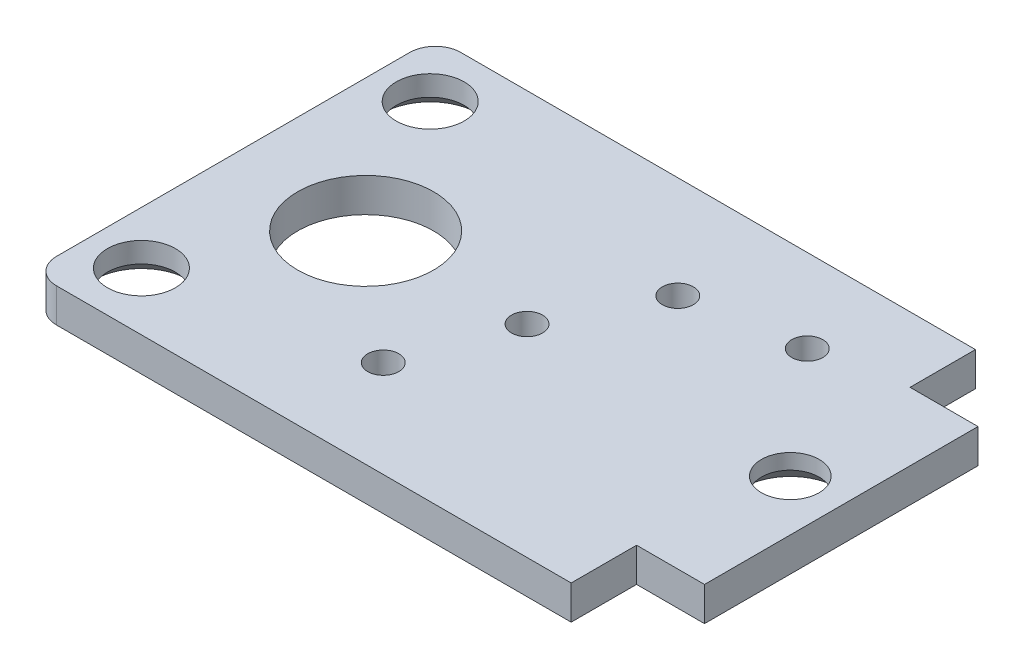
ISO-10303-21;
HEADER;
FILE_DESCRIPTION(('STEP AP214'),'2;1');
FILE_NAME('part.step','',(''),(''),'','','');
FILE_SCHEMA(('AUTOMOTIVE_DESIGN { 1 0 10303 214 1 1 1 1 }'));
ENDSEC;
DATA;
#1=APPLICATION_CONTEXT('core data for automotive mechanical design processes');
#2=APPLICATION_PROTOCOL_DEFINITION('international standard','automotive_design',2000,#1);
#3=PRODUCT_CONTEXT('',#1,'mechanical');
#4=PRODUCT('Part','Part','',(#3));
#5=PRODUCT_RELATED_PRODUCT_CATEGORY('part','',(#4));
#6=PRODUCT_DEFINITION_FORMATION('','',#4);
#7=PRODUCT_DEFINITION_CONTEXT('part definition',#1,'design');
#8=PRODUCT_DEFINITION('design','',#6,#7);
#9=PRODUCT_DEFINITION_SHAPE('','',#8);
#10=(LENGTH_UNIT() NAMED_UNIT(*) SI_UNIT(.MILLI.,.METRE.));
#11=(NAMED_UNIT(*) PLANE_ANGLE_UNIT() SI_UNIT($,.RADIAN.));
#12=(NAMED_UNIT(*) SI_UNIT($,.STERADIAN.) SOLID_ANGLE_UNIT());
#13=UNCERTAINTY_MEASURE_WITH_UNIT(LENGTH_MEASURE(1.E-05),#10,'distance_accuracy_value','');
#14=(GEOMETRIC_REPRESENTATION_CONTEXT(3) GLOBAL_UNCERTAINTY_ASSIGNED_CONTEXT((#13)) GLOBAL_UNIT_ASSIGNED_CONTEXT((#10,
#11,#12)) REPRESENTATION_CONTEXT('',''));
#15=CARTESIAN_POINT('',(0.,0.,0.));
#16=DIRECTION('',(0.,0.,1.));
#17=DIRECTION('',(1.,0.,0.));
#18=AXIS2_PLACEMENT_3D('',#15,#16,#17);
#19=CARTESIAN_POINT('',(0.,1.,0.));
#20=DIRECTION('',(0.,-1.,0.));
#21=DIRECTION('',(0.,0.,-1.));
#22=AXIS2_PLACEMENT_3D('',#19,#20,#21);
#23=PLANE('',#22);
#24=CARTESIAN_POINT('',(12.5,1.,0.));
#25=DIRECTION('',(0.,-1.,0.));
#26=DIRECTION('',(0.,0.,-1.));
#27=AXIS2_PLACEMENT_3D('',#24,#25,#26);
#28=CIRCLE('',#27,0.849999999999998);
#29=CARTESIAN_POINT('',(12.5,1.,-0.849999999999998));
#30=VERTEX_POINT('',#29);
#31=EDGE_CURVE('E515',#30,#30,#28,.T.);
#32=ORIENTED_EDGE('',*,*,#31,.T.);
#33=EDGE_LOOP('',(#32));
#34=FACE_BOUND('',#33,.T.);
#35=CARTESIAN_POINT('',(3.61862915010152,1.,3.1));
#36=DIRECTION('',(0.,1.,0.));
#37=DIRECTION('',(0.,0.,1.));
#38=AXIS2_PLACEMENT_3D('',#35,#36,#37);
#39=CIRCLE('',#38,0.457200000000001);
#40=CARTESIAN_POINT('',(3.61862915010152,1.,3.5572));
#41=VERTEX_POINT('',#40);
#42=EDGE_CURVE('E525',#41,#41,#39,.T.);
#43=ORIENTED_EDGE('',*,*,#42,.F.);
#44=EDGE_LOOP('',(#43));
#45=FACE_BOUND('',#44,.T.);
#46=CARTESIAN_POINT('',(4.75,1.,0.));
#47=DIRECTION('',(0.,1.,0.));
#48=DIRECTION('',(0.,0.,1.));
#49=AXIS2_PLACEMENT_3D('',#46,#47,#48);
#50=CIRCLE('',#49,0.4572);
#51=CARTESIAN_POINT('',(4.75,1.,0.4572));
#52=VERTEX_POINT('',#51);
#53=EDGE_CURVE('E533',#52,#52,#50,.T.);
#54=ORIENTED_EDGE('',*,*,#53,.F.);
#55=EDGE_LOOP('',(#54));
#56=FACE_BOUND('',#55,.T.);
#57=CARTESIAN_POINT('',(6.24777213603638,1.,-2.94052352966492));
#58=DIRECTION('',(0.,1.,0.));
#59=DIRECTION('',(0.,0.,1.));
#60=AXIS2_PLACEMENT_3D('',#57,#58,#59);
#61=CIRCLE('',#60,0.4572);
#62=CARTESIAN_POINT('',(6.24777213603638,1.,-2.48332352966492));
#63=VERTEX_POINT('',#62);
#64=EDGE_CURVE('E541',#63,#63,#61,.T.);
#65=ORIENTED_EDGE('',*,*,#64,.F.);
#66=EDGE_LOOP('',(#65));
#67=FACE_BOUND('',#66,.T.);
#68=CARTESIAN_POINT('',(9.5,1.,-3.5));
#69=DIRECTION('',(0.,1.,0.));
#70=DIRECTION('',(0.,0.,1.));
#71=AXIS2_PLACEMENT_3D('',#68,#69,#70);
#72=CIRCLE('',#71,0.4572);
#73=CARTESIAN_POINT('',(9.5,1.,-3.0428));
#74=VERTEX_POINT('',#73);
#75=EDGE_CURVE('E520',#74,#74,#72,.T.);
#76=ORIENTED_EDGE('',*,*,#75,.F.);
#77=EDGE_LOOP('',(#76));
#78=FACE_BOUND('',#77,.T.);
#79=CARTESIAN_POINT('',(-2.34999999999999,1.,-4.25));
#80=DIRECTION('',(0.,1.,0.));
#81=DIRECTION('',(0.,0.,1.));
#82=AXIS2_PLACEMENT_3D('',#79,#80,#81);
#83=CIRCLE('',#82,1.);
#84=CARTESIAN_POINT('',(-2.34999999999999,1.,-3.25));
#85=VERTEX_POINT('',#84);
#86=EDGE_CURVE('E267',#85,#85,#83,.T.);
#87=ORIENTED_EDGE('',*,*,#86,.F.);
#88=EDGE_LOOP('',(#87));
#89=FACE_BOUND('',#88,.T.);
#90=CARTESIAN_POINT('',(-2.34999999999999,1.,4.25));
#91=DIRECTION('',(0.,1.,0.));
#92=DIRECTION('',(0.,0.,1.));
#93=AXIS2_PLACEMENT_3D('',#90,#91,#92);
#94=CIRCLE('',#93,1.);
#95=CARTESIAN_POINT('',(-2.34999999999999,1.,5.25));
#96=VERTEX_POINT('',#95);
#97=EDGE_CURVE('E274',#96,#96,#94,.T.);
#98=ORIENTED_EDGE('',*,*,#97,.F.);
#99=EDGE_LOOP('',(#98));
#100=FACE_BOUND('',#99,.T.);
#101=DIRECTION('',(-1.,0.,0.));
#102=VECTOR('',#101,1.);
#103=CARTESIAN_POINT('',(12.,1.,-5.95));
#104=LINE('',#103,#102);
#105=CARTESIAN_POINT('',(12.,1.,-5.95));
#106=VERTEX_POINT('',#105);
#107=CARTESIAN_POINT('',(-3.15,1.,-5.95));
#108=VERTEX_POINT('',#107);
#109=EDGE_CURVE('E164',#106,#108,#104,.T.);
#110=ORIENTED_EDGE('',*,*,#109,.T.);
#111=CARTESIAN_POINT('',(-3.14999999999999,1.,-5.2));
#112=DIRECTION('',(0.,-1.,0.));
#113=DIRECTION('',(0.,0.,-1.));
#114=AXIS2_PLACEMENT_3D('',#111,#112,#113);
#115=CIRCLE('',#114,0.75);
#116=CARTESIAN_POINT('',(-3.89999999999999,1.,-5.2));
#117=VERTEX_POINT('',#116);
#118=EDGE_CURVE('E226',#108,#117,#115,.F.);
#119=ORIENTED_EDGE('',*,*,#118,.T.);
#120=DIRECTION('',(0.,0.,1.));
#121=VECTOR('',#120,1.);
#122=CARTESIAN_POINT('',(-3.89999999999999,1.,-5.95));
#123=LINE('',#122,#121);
#124=CARTESIAN_POINT('',(-3.89999999999999,1.,5.2));
#125=VERTEX_POINT('',#124);
#126=EDGE_CURVE('E132',#117,#125,#123,.T.);
#127=ORIENTED_EDGE('',*,*,#126,.T.);
#128=CARTESIAN_POINT('',(-3.15,1.,5.2));
#129=DIRECTION('',(0.,-1.,0.));
#130=DIRECTION('',(0.,0.,-1.));
#131=AXIS2_PLACEMENT_3D('',#128,#129,#130);
#132=CIRCLE('',#131,0.75);
#133=CARTESIAN_POINT('',(-3.15,1.,5.95));
#134=VERTEX_POINT('',#133);
#135=EDGE_CURVE('E60',#125,#134,#132,.F.);
#136=ORIENTED_EDGE('',*,*,#135,.T.);
#137=DIRECTION('',(1.,0.,0.));
#138=VECTOR('',#137,1.);
#139=CARTESIAN_POINT('',(12.,1.,5.95));
#140=LINE('',#139,#138);
#141=CARTESIAN_POINT('',(12.,1.,5.95));
#142=VERTEX_POINT('',#141);
#143=EDGE_CURVE('E122',#134,#142,#140,.T.);
#144=ORIENTED_EDGE('',*,*,#143,.T.);
#145=DIRECTION('',(0.,0.,-1.));
#146=VECTOR('',#145,1.);
#147=CARTESIAN_POINT('',(12.,1.,5.95));
#148=LINE('',#147,#146);
#149=CARTESIAN_POINT('',(12.,1.,4.025));
#150=VERTEX_POINT('',#149);
#151=EDGE_CURVE('E126',#142,#150,#148,.T.);
#152=ORIENTED_EDGE('',*,*,#151,.T.);
#153=DIRECTION('',(1.,0.,0.));
#154=VECTOR('',#153,1.);
#155=CARTESIAN_POINT('',(12.,1.,4.025));
#156=LINE('',#155,#154);
#157=CARTESIAN_POINT('',(14.,1.,4.025));
#158=VERTEX_POINT('',#157);
#159=EDGE_CURVE('E149',#150,#158,#156,.T.);
#160=ORIENTED_EDGE('',*,*,#159,.T.);
#161=DIRECTION('',(0.,0.,-1.));
#162=VECTOR('',#161,1.);
#163=CARTESIAN_POINT('',(14.,1.,-4.025));
#164=LINE('',#163,#162);
#165=CARTESIAN_POINT('',(14.,1.,-4.025));
#166=VERTEX_POINT('',#165);
#167=EDGE_CURVE('E152',#158,#166,#164,.T.);
#168=ORIENTED_EDGE('',*,*,#167,.T.);
#169=DIRECTION('',(-1.,0.,0.));
#170=VECTOR('',#169,1.);
#171=CARTESIAN_POINT('',(12.,1.,-4.025));
#172=LINE('',#171,#170);
#173=CARTESIAN_POINT('',(12.,1.,-4.025));
#174=VERTEX_POINT('',#173);
#175=EDGE_CURVE('E158',#166,#174,#172,.T.);
#176=ORIENTED_EDGE('',*,*,#175,.T.);
#177=DIRECTION('',(0.,0.,-1.));
#178=VECTOR('',#177,1.);
#179=CARTESIAN_POINT('',(12.,1.,-5.95));
#180=LINE('',#179,#178);
#181=EDGE_CURVE('E161',#174,#106,#180,.T.);
#182=ORIENTED_EDGE('',*,*,#181,.T.);
#183=EDGE_LOOP('',(#110,#119,#127,#136,#144,#152,#160,#168,#176,#182));
#184=FACE_BOUND('',#183,.T.);
#185=CARTESIAN_POINT('',(0.,1.,0.));
#186=DIRECTION('',(0.,1.,0.));
#187=DIRECTION('',(0.,0.,1.));
#188=AXIS2_PLACEMENT_3D('',#185,#186,#187);
#189=CIRCLE('',#188,2.);
#190=CARTESIAN_POINT('',(0.,1.,2.));
#191=VERTEX_POINT('',#190);
#192=EDGE_CURVE('E172',#191,#191,#189,.T.);
#193=ORIENTED_EDGE('',*,*,#192,.F.);
#194=EDGE_LOOP('',(#193));
#195=FACE_BOUND('',#194,.T.);
#196=ADVANCED_FACE('F43',(#34,#45,#56,#67,#78,#89,#100,#184,#195),#23,.F.);
#197=CARTESIAN_POINT('',(0.,0.,0.));
#198=DIRECTION('',(0.,-1.,0.));
#199=DIRECTION('',(0.,0.,-1.));
#200=AXIS2_PLACEMENT_3D('',#197,#198,#199);
#201=PLANE('',#200);
#202=CARTESIAN_POINT('',(12.5,0.,0.));
#203=DIRECTION('',(0.,-1.,0.));
#204=DIRECTION('',(0.,0.,-1.));
#205=AXIS2_PLACEMENT_3D('',#202,#203,#204);
#206=CIRCLE('',#205,1.4);
#207=CARTESIAN_POINT('',(12.5,0.,-1.4));
#208=VERTEX_POINT('',#207);
#209=EDGE_CURVE('E511',#208,#208,#206,.T.);
#210=ORIENTED_EDGE('',*,*,#209,.F.);
#211=EDGE_LOOP('',(#210));
#212=FACE_BOUND('',#211,.T.);
#213=CARTESIAN_POINT('',(3.61862915010152,0.,3.1));
#214=DIRECTION('',(0.,1.,0.));
#215=DIRECTION('',(0.,0.,1.));
#216=AXIS2_PLACEMENT_3D('',#213,#214,#215);
#217=CIRCLE('',#216,0.457200000000001);
#218=CARTESIAN_POINT('',(3.61862915010152,0.,3.5572));
#219=VERTEX_POINT('',#218);
#220=EDGE_CURVE('E521',#219,#219,#217,.T.);
#221=ORIENTED_EDGE('',*,*,#220,.T.);
#222=EDGE_LOOP('',(#221));
#223=FACE_BOUND('',#222,.T.);
#224=CARTESIAN_POINT('',(4.75,0.,0.));
#225=DIRECTION('',(0.,1.,0.));
#226=DIRECTION('',(0.,0.,1.));
#227=AXIS2_PLACEMENT_3D('',#224,#225,#226);
#228=CIRCLE('',#227,0.4572);
#229=CARTESIAN_POINT('',(4.75,0.,0.4572));
#230=VERTEX_POINT('',#229);
#231=EDGE_CURVE('E529',#230,#230,#228,.T.);
#232=ORIENTED_EDGE('',*,*,#231,.T.);
#233=EDGE_LOOP('',(#232));
#234=FACE_BOUND('',#233,.T.);
#235=CARTESIAN_POINT('',(6.24777213603638,0.,-2.94052352966492));
#236=DIRECTION('',(0.,1.,0.));
#237=DIRECTION('',(0.,0.,1.));
#238=AXIS2_PLACEMENT_3D('',#235,#236,#237);
#239=CIRCLE('',#238,0.4572);
#240=CARTESIAN_POINT('',(6.24777213603638,0.,-2.48332352966492));
#241=VERTEX_POINT('',#240);
#242=EDGE_CURVE('E537',#241,#241,#239,.T.);
#243=ORIENTED_EDGE('',*,*,#242,.T.);
#244=EDGE_LOOP('',(#243));
#245=FACE_BOUND('',#244,.T.);
#246=CARTESIAN_POINT('',(9.5,0.,-3.5));
#247=DIRECTION('',(0.,1.,0.));
#248=DIRECTION('',(0.,0.,1.));
#249=AXIS2_PLACEMENT_3D('',#246,#247,#248);
#250=CIRCLE('',#249,0.4572);
#251=CARTESIAN_POINT('',(9.5,0.,-3.0428));
#252=VERTEX_POINT('',#251);
#253=EDGE_CURVE('E545',#252,#252,#250,.T.);
#254=ORIENTED_EDGE('',*,*,#253,.T.);
#255=EDGE_LOOP('',(#254));
#256=FACE_BOUND('',#255,.T.);
#257=CARTESIAN_POINT('',(-2.34999999999999,0.,4.25));
#258=DIRECTION('',(0.,-1.,0.));
#259=DIRECTION('',(0.,0.,-1.));
#260=AXIS2_PLACEMENT_3D('',#257,#258,#259);
#261=CIRCLE('',#260,1.4);
#262=CARTESIAN_POINT('',(-2.34999999999999,0.,2.85));
#263=VERTEX_POINT('',#262);
#264=EDGE_CURVE('E236',#263,#263,#261,.F.);
#265=ORIENTED_EDGE('',*,*,#264,.T.);
#266=EDGE_LOOP('',(#265));
#267=FACE_BOUND('',#266,.T.);
#268=CARTESIAN_POINT('',(-2.34999999999999,0.,-4.25));
#269=DIRECTION('',(0.,-1.,0.));
#270=DIRECTION('',(0.,0.,-1.));
#271=AXIS2_PLACEMENT_3D('',#268,#269,#270);
#272=CIRCLE('',#271,1.4);
#273=CARTESIAN_POINT('',(-2.34999999999999,0.,-5.65));
#274=VERTEX_POINT('',#273);
#275=EDGE_CURVE('E232',#274,#274,#272,.F.);
#276=ORIENTED_EDGE('',*,*,#275,.T.);
#277=EDGE_LOOP('',(#276));
#278=FACE_BOUND('',#277,.T.);
#279=DIRECTION('',(0.,0.,1.));
#280=VECTOR('',#279,1.);
#281=CARTESIAN_POINT('',(-3.89999999999999,0.,-5.95));
#282=LINE('',#281,#280);
#283=CARTESIAN_POINT('',(-3.89999999999999,0.,-5.2));
#284=VERTEX_POINT('',#283);
#285=CARTESIAN_POINT('',(-3.89999999999999,0.,5.2));
#286=VERTEX_POINT('',#285);
#287=EDGE_CURVE('E168',#284,#286,#282,.T.);
#288=ORIENTED_EDGE('',*,*,#287,.F.);
#289=CARTESIAN_POINT('',(-3.14999999999999,0.,-5.2));
#290=DIRECTION('',(0.,-1.,0.));
#291=DIRECTION('',(0.,0.,-1.));
#292=AXIS2_PLACEMENT_3D('',#289,#290,#291);
#293=CIRCLE('',#292,0.75);
#294=CARTESIAN_POINT('',(-3.15,0.,-5.95));
#295=VERTEX_POINT('',#294);
#296=EDGE_CURVE('E219',#284,#295,#293,.T.);
#297=ORIENTED_EDGE('',*,*,#296,.T.);
#298=DIRECTION('',(-1.,0.,0.));
#299=VECTOR('',#298,1.);
#300=CARTESIAN_POINT('',(12.,0.,-5.95));
#301=LINE('',#300,#299);
#302=CARTESIAN_POINT('',(12.,0.,-5.95));
#303=VERTEX_POINT('',#302);
#304=EDGE_CURVE('E190',#303,#295,#301,.T.);
#305=ORIENTED_EDGE('',*,*,#304,.F.);
#306=DIRECTION('',(0.,0.,-1.));
#307=VECTOR('',#306,1.);
#308=CARTESIAN_POINT('',(12.,0.,-5.95));
#309=LINE('',#308,#307);
#310=CARTESIAN_POINT('',(12.,0.,-4.025));
#311=VERTEX_POINT('',#310);
#312=EDGE_CURVE('E187',#311,#303,#309,.T.);
#313=ORIENTED_EDGE('',*,*,#312,.F.);
#314=DIRECTION('',(-1.,0.,0.));
#315=VECTOR('',#314,1.);
#316=CARTESIAN_POINT('',(12.,0.,-4.025));
#317=LINE('',#316,#315);
#318=CARTESIAN_POINT('',(14.,0.,-4.025));
#319=VERTEX_POINT('',#318);
#320=EDGE_CURVE('E184',#319,#311,#317,.T.);
#321=ORIENTED_EDGE('',*,*,#320,.F.);
#322=DIRECTION('',(0.,0.,-1.));
#323=VECTOR('',#322,1.);
#324=CARTESIAN_POINT('',(14.,0.,-4.025));
#325=LINE('',#324,#323);
#326=CARTESIAN_POINT('',(14.,0.,4.025));
#327=VERTEX_POINT('',#326);
#328=EDGE_CURVE('E181',#327,#319,#325,.T.);
#329=ORIENTED_EDGE('',*,*,#328,.F.);
#330=DIRECTION('',(1.,0.,0.));
#331=VECTOR('',#330,1.);
#332=CARTESIAN_POINT('',(12.,0.,4.025));
#333=LINE('',#332,#331);
#334=CARTESIAN_POINT('',(12.,0.,4.025));
#335=VERTEX_POINT('',#334);
#336=EDGE_CURVE('E178',#335,#327,#333,.T.);
#337=ORIENTED_EDGE('',*,*,#336,.F.);
#338=DIRECTION('',(0.,0.,-1.));
#339=VECTOR('',#338,1.);
#340=CARTESIAN_POINT('',(12.,0.,5.95));
#341=LINE('',#340,#339);
#342=CARTESIAN_POINT('',(12.,0.,5.95));
#343=VERTEX_POINT('',#342);
#344=EDGE_CURVE('E175',#343,#335,#341,.T.);
#345=ORIENTED_EDGE('',*,*,#344,.F.);
#346=DIRECTION('',(1.,0.,0.));
#347=VECTOR('',#346,1.);
#348=CARTESIAN_POINT('',(12.,0.,5.95));
#349=LINE('',#348,#347);
#350=CARTESIAN_POINT('',(-3.15,0.,5.95));
#351=VERTEX_POINT('',#350);
#352=EDGE_CURVE('E138',#351,#343,#349,.T.);
#353=ORIENTED_EDGE('',*,*,#352,.F.);
#354=CARTESIAN_POINT('',(-3.15,0.,5.2));
#355=DIRECTION('',(0.,-1.,0.));
#356=DIRECTION('',(0.,0.,-1.));
#357=AXIS2_PLACEMENT_3D('',#354,#355,#356);
#358=CIRCLE('',#357,0.75);
#359=EDGE_CURVE('E216',#351,#286,#358,.T.);
#360=ORIENTED_EDGE('',*,*,#359,.T.);
#361=EDGE_LOOP('',(#288,#297,#305,#313,#321,#329,#337,#345,#353,#360));
#362=FACE_BOUND('',#361,.T.);
#363=CARTESIAN_POINT('',(0.,0.,0.));
#364=DIRECTION('',(0.,1.,0.));
#365=DIRECTION('',(0.,0.,1.));
#366=AXIS2_PLACEMENT_3D('',#363,#364,#365);
#367=CIRCLE('',#366,2.);
#368=CARTESIAN_POINT('',(0.,0.,2.));
#369=VERTEX_POINT('',#368);
#370=EDGE_CURVE('E264',#369,#369,#367,.T.);
#371=ORIENTED_EDGE('',*,*,#370,.T.);
#372=EDGE_LOOP('',(#371));
#373=FACE_BOUND('',#372,.T.);
#374=ADVANCED_FACE('F252',(#212,#223,#234,#245,#256,#267,#278,#362,#373),#201,.T.);
#375=CARTESIAN_POINT('',(-3.89999999999999,1.,-5.95));
#376=DIRECTION('',(1.,0.,0.));
#377=DIRECTION('',(0.,0.,-1.));
#378=AXIS2_PLACEMENT_3D('',#375,#376,#377);
#379=PLANE('',#378);
#380=ORIENTED_EDGE('',*,*,#126,.F.);
#381=DIRECTION('',(0.,-1.,0.));
#382=VECTOR('',#381,1.);
#383=CARTESIAN_POINT('',(-3.89999999999999,1.,-5.2));
#384=LINE('',#383,#382);
#385=EDGE_CURVE('E212',#117,#284,#384,.T.);
#386=ORIENTED_EDGE('',*,*,#385,.T.);
#387=ORIENTED_EDGE('',*,*,#287,.T.);
#388=DIRECTION('',(0.,-1.,0.));
#389=VECTOR('',#388,1.);
#390=CARTESIAN_POINT('',(-3.89999999999999,1.,5.2));
#391=LINE('',#390,#389);
#392=EDGE_CURVE('E142',#286,#125,#391,.F.);
#393=ORIENTED_EDGE('',*,*,#392,.T.);
#394=EDGE_LOOP('',(#380,#386,#387,#393));
#395=FACE_BOUND('',#394,.T.);
#396=ADVANCED_FACE('F255',(#395),#379,.F.);
#397=CARTESIAN_POINT('',(12.,1.,5.95));
#398=DIRECTION('',(0.,0.,-1.));
#399=DIRECTION('',(-1.,0.,0.));
#400=AXIS2_PLACEMENT_3D('',#397,#398,#399);
#401=PLANE('',#400);
#402=ORIENTED_EDGE('',*,*,#143,.F.);
#403=DIRECTION('',(0.,-1.,0.));
#404=VECTOR('',#403,1.);
#405=CARTESIAN_POINT('',(-3.15,1.,5.95));
#406=LINE('',#405,#404);
#407=EDGE_CURVE('E229',#134,#351,#406,.T.);
#408=ORIENTED_EDGE('',*,*,#407,.T.);
#409=ORIENTED_EDGE('',*,*,#352,.T.);
#410=DIRECTION('',(0.,-1.,0.));
#411=VECTOR('',#410,1.);
#412=CARTESIAN_POINT('',(12.,1.,5.95));
#413=LINE('',#412,#411);
#414=EDGE_CURVE('E135',#142,#343,#413,.T.);
#415=ORIENTED_EDGE('',*,*,#414,.F.);
#416=EDGE_LOOP('',(#402,#408,#409,#415));
#417=FACE_BOUND('',#416,.T.);
#418=ADVANCED_FACE('F136',(#417),#401,.F.);
#419=CARTESIAN_POINT('',(12.,1.,5.95));
#420=DIRECTION('',(-1.,0.,0.));
#421=DIRECTION('',(0.,0.,1.));
#422=AXIS2_PLACEMENT_3D('',#419,#420,#421);
#423=PLANE('',#422);
#424=ORIENTED_EDGE('',*,*,#344,.T.);
#425=DIRECTION('',(0.,-1.,0.));
#426=VECTOR('',#425,1.);
#427=CARTESIAN_POINT('',(12.,1.,4.025));
#428=LINE('',#427,#426);
#429=EDGE_CURVE('E143',#150,#335,#428,.T.);
#430=ORIENTED_EDGE('',*,*,#429,.F.);
#431=ORIENTED_EDGE('',*,*,#151,.F.);
#432=ORIENTED_EDGE('',*,*,#414,.T.);
#433=EDGE_LOOP('',(#424,#430,#431,#432));
#434=FACE_BOUND('',#433,.T.);
#435=ADVANCED_FACE('F145',(#434),#423,.F.);
#436=CARTESIAN_POINT('',(12.,1.,4.025));
#437=DIRECTION('',(0.,0.,-1.));
#438=DIRECTION('',(-1.,0.,0.));
#439=AXIS2_PLACEMENT_3D('',#436,#437,#438);
#440=PLANE('',#439);
#441=ORIENTED_EDGE('',*,*,#336,.T.);
#442=DIRECTION('',(0.,-1.,0.));
#443=VECTOR('',#442,1.);
#444=CARTESIAN_POINT('',(14.,1.,4.025));
#445=LINE('',#444,#443);
#446=EDGE_CURVE('E204',#158,#327,#445,.T.);
#447=ORIENTED_EDGE('',*,*,#446,.F.);
#448=ORIENTED_EDGE('',*,*,#159,.F.);
#449=ORIENTED_EDGE('',*,*,#429,.T.);
#450=EDGE_LOOP('',(#441,#447,#448,#449));
#451=FACE_BOUND('',#450,.T.);
#452=ADVANCED_FACE('F287',(#451),#440,.F.);
#453=CARTESIAN_POINT('',(14.,1.,-4.025));
#454=DIRECTION('',(-1.,0.,0.));
#455=DIRECTION('',(0.,0.,1.));
#456=AXIS2_PLACEMENT_3D('',#453,#454,#455);
#457=PLANE('',#456);
#458=ORIENTED_EDGE('',*,*,#328,.T.);
#459=DIRECTION('',(0.,-1.,0.));
#460=VECTOR('',#459,1.);
#461=CARTESIAN_POINT('',(14.,1.,-4.025));
#462=LINE('',#461,#460);
#463=EDGE_CURVE('E200',#166,#319,#462,.T.);
#464=ORIENTED_EDGE('',*,*,#463,.F.);
#465=ORIENTED_EDGE('',*,*,#167,.F.);
#466=ORIENTED_EDGE('',*,*,#446,.T.);
#467=EDGE_LOOP('',(#458,#464,#465,#466));
#468=FACE_BOUND('',#467,.T.);
#469=ADVANCED_FACE('F294',(#468),#457,.F.);
#470=CARTESIAN_POINT('',(12.,1.,-4.025));
#471=DIRECTION('',(0.,0.,1.));
#472=DIRECTION('',(1.,0.,0.));
#473=AXIS2_PLACEMENT_3D('',#470,#471,#472);
#474=PLANE('',#473);
#475=ORIENTED_EDGE('',*,*,#320,.T.);
#476=DIRECTION('',(0.,-1.,0.));
#477=VECTOR('',#476,1.);
#478=CARTESIAN_POINT('',(12.,1.,-4.025));
#479=LINE('',#478,#477);
#480=EDGE_CURVE('E196',#174,#311,#479,.T.);
#481=ORIENTED_EDGE('',*,*,#480,.F.);
#482=ORIENTED_EDGE('',*,*,#175,.F.);
#483=ORIENTED_EDGE('',*,*,#463,.T.);
#484=EDGE_LOOP('',(#475,#481,#482,#483));
#485=FACE_BOUND('',#484,.T.);
#486=ADVANCED_FACE('F297',(#485),#474,.F.);
#487=CARTESIAN_POINT('',(12.,1.,-5.95));
#488=DIRECTION('',(-1.,0.,0.));
#489=DIRECTION('',(0.,0.,1.));
#490=AXIS2_PLACEMENT_3D('',#487,#488,#489);
#491=PLANE('',#490);
#492=ORIENTED_EDGE('',*,*,#312,.T.);
#493=DIRECTION('',(0.,-1.,0.));
#494=VECTOR('',#493,1.);
#495=CARTESIAN_POINT('',(12.,1.,-5.95));
#496=LINE('',#495,#494);
#497=EDGE_CURVE('E167',#106,#303,#496,.T.);
#498=ORIENTED_EDGE('',*,*,#497,.F.);
#499=ORIENTED_EDGE('',*,*,#181,.F.);
#500=ORIENTED_EDGE('',*,*,#480,.T.);
#501=EDGE_LOOP('',(#492,#498,#499,#500));
#502=FACE_BOUND('',#501,.T.);
#503=ADVANCED_FACE('F302',(#502),#491,.F.);
#504=CARTESIAN_POINT('',(12.,1.,-5.95));
#505=DIRECTION('',(0.,0.,1.));
#506=DIRECTION('',(1.,0.,0.));
#507=AXIS2_PLACEMENT_3D('',#504,#505,#506);
#508=PLANE('',#507);
#509=ORIENTED_EDGE('',*,*,#304,.T.);
#510=DIRECTION('',(0.,-1.,0.));
#511=VECTOR('',#510,1.);
#512=CARTESIAN_POINT('',(-3.15,1.,-5.95));
#513=LINE('',#512,#511);
#514=EDGE_CURVE('E68',#295,#108,#513,.F.);
#515=ORIENTED_EDGE('',*,*,#514,.T.);
#516=ORIENTED_EDGE('',*,*,#109,.F.);
#517=ORIENTED_EDGE('',*,*,#497,.T.);
#518=EDGE_LOOP('',(#509,#515,#516,#517));
#519=FACE_BOUND('',#518,.T.);
#520=ADVANCED_FACE('F323',(#519),#508,.F.);
#521=CARTESIAN_POINT('',(0.,1.,0.));
#522=DIRECTION('',(0.,-1.,0.));
#523=DIRECTION('',(0.,0.,-1.));
#524=AXIS2_PLACEMENT_3D('',#521,#522,#523);
#525=CYLINDRICAL_SURFACE('',#524,2.);
#526=ORIENTED_EDGE('',*,*,#192,.T.);
#527=EDGE_LOOP('',(#526));
#528=FACE_BOUND('',#527,.T.);
#529=ORIENTED_EDGE('',*,*,#370,.F.);
#530=EDGE_LOOP('',(#529));
#531=FACE_BOUND('',#530,.T.);
#532=ADVANCED_FACE('F320',(#528,#531),#525,.F.);
#533=CARTESIAN_POINT('',(-2.34999999999999,0.,4.25));
#534=DIRECTION('',(0.,1.,0.));
#535=DIRECTION('',(0.,0.,1.));
#536=AXIS2_PLACEMENT_3D('',#533,#534,#535);
#537=CYLINDRICAL_SURFACE('',#536,1.);
#538=CARTESIAN_POINT('',(-2.34999999999999,0.400000000000002,4.25));
#539=DIRECTION('',(0.,-1.,0.));
#540=DIRECTION('',(0.,0.,-1.));
#541=AXIS2_PLACEMENT_3D('',#538,#539,#540);
#542=CIRCLE('',#541,1.);
#543=CARTESIAN_POINT('',(-2.34999999999999,0.400000000000002,3.25));
#544=VERTEX_POINT('',#543);
#545=EDGE_CURVE('E53',#544,#544,#542,.T.);
#546=ORIENTED_EDGE('',*,*,#545,.T.);
#547=EDGE_LOOP('',(#546));
#548=FACE_BOUND('',#547,.T.);
#549=ORIENTED_EDGE('',*,*,#97,.T.);
#550=EDGE_LOOP('',(#549));
#551=FACE_BOUND('',#550,.T.);
#552=ADVANCED_FACE('F243',(#548,#551),#537,.F.);
#553=CARTESIAN_POINT('',(-2.34999999999999,0.,-4.25));
#554=DIRECTION('',(0.,1.,0.));
#555=DIRECTION('',(0.,0.,1.));
#556=AXIS2_PLACEMENT_3D('',#553,#554,#555);
#557=CYLINDRICAL_SURFACE('',#556,1.);
#558=CARTESIAN_POINT('',(-2.34999999999999,0.400000000000003,-4.25));
#559=DIRECTION('',(0.,-1.,0.));
#560=DIRECTION('',(0.,0.,-1.));
#561=AXIS2_PLACEMENT_3D('',#558,#559,#560);
#562=CIRCLE('',#561,1.);
#563=CARTESIAN_POINT('',(-2.34999999999999,0.400000000000003,-5.25));
#564=VERTEX_POINT('',#563);
#565=EDGE_CURVE('E11',#564,#564,#562,.T.);
#566=ORIENTED_EDGE('',*,*,#565,.T.);
#567=EDGE_LOOP('',(#566));
#568=FACE_BOUND('',#567,.T.);
#569=ORIENTED_EDGE('',*,*,#86,.T.);
#570=EDGE_LOOP('',(#569));
#571=FACE_BOUND('',#570,.T.);
#572=ADVANCED_FACE('F372',(#568,#571),#557,.F.);
#573=CARTESIAN_POINT('',(-3.14999999999999,1.,-5.2));
#574=DIRECTION('',(0.,-1.,0.));
#575=DIRECTION('',(0.,0.,-1.));
#576=AXIS2_PLACEMENT_3D('',#573,#574,#575);
#577=CYLINDRICAL_SURFACE('',#576,0.75);
#578=ORIENTED_EDGE('',*,*,#118,.F.);
#579=ORIENTED_EDGE('',*,*,#514,.F.);
#580=ORIENTED_EDGE('',*,*,#296,.F.);
#581=ORIENTED_EDGE('',*,*,#385,.F.);
#582=EDGE_LOOP('',(#578,#579,#580,#581));
#583=FACE_BOUND('',#582,.T.);
#584=ADVANCED_FACE('F304',(#583),#577,.T.);
#585=CARTESIAN_POINT('',(-3.15,1.,5.2));
#586=DIRECTION('',(0.,-1.,0.));
#587=DIRECTION('',(0.,0.,-1.));
#588=AXIS2_PLACEMENT_3D('',#585,#586,#587);
#589=CYLINDRICAL_SURFACE('',#588,0.75);
#590=ORIENTED_EDGE('',*,*,#135,.F.);
#591=ORIENTED_EDGE('',*,*,#392,.F.);
#592=ORIENTED_EDGE('',*,*,#359,.F.);
#593=ORIENTED_EDGE('',*,*,#407,.F.);
#594=EDGE_LOOP('',(#590,#591,#592,#593));
#595=FACE_BOUND('',#594,.T.);
#596=ADVANCED_FACE('F249',(#595),#589,.T.);
#597=CARTESIAN_POINT('',(-2.34999999999999,0.,4.25));
#598=DIRECTION('',(0.,-1.,0.));
#599=DIRECTION('',(0.,0.,-1.));
#600=AXIS2_PLACEMENT_3D('',#597,#598,#599);
#601=CONICAL_SURFACE('',#600,1.4,0.785398163397446);
#602=ORIENTED_EDGE('',*,*,#545,.F.);
#603=EDGE_LOOP('',(#602));
#604=FACE_BOUND('',#603,.T.);
#605=ORIENTED_EDGE('',*,*,#264,.F.);
#606=EDGE_LOOP('',(#605));
#607=FACE_BOUND('',#606,.T.);
#608=ADVANCED_FACE('F246',(#604,#607),#601,.F.);
#609=CARTESIAN_POINT('',(-2.34999999999999,0.,-4.25));
#610=DIRECTION('',(0.,-1.,0.));
#611=DIRECTION('',(0.,0.,-1.));
#612=AXIS2_PLACEMENT_3D('',#609,#610,#611);
#613=CONICAL_SURFACE('',#612,1.4,0.785398163397446);
#614=ORIENTED_EDGE('',*,*,#565,.F.);
#615=EDGE_LOOP('',(#614));
#616=FACE_BOUND('',#615,.T.);
#617=ORIENTED_EDGE('',*,*,#275,.F.);
#618=EDGE_LOOP('',(#617));
#619=FACE_BOUND('',#618,.T.);
#620=ADVANCED_FACE('F46',(#616,#619),#613,.F.);
#621=CARTESIAN_POINT('',(9.5,0.,-3.5));
#622=DIRECTION('',(0.,1.,0.));
#623=DIRECTION('',(0.,0.,1.));
#624=AXIS2_PLACEMENT_3D('',#621,#622,#623);
#625=CYLINDRICAL_SURFACE('',#624,0.4572);
#626=ORIENTED_EDGE('',*,*,#253,.F.);
#627=EDGE_LOOP('',(#626));
#628=FACE_BOUND('',#627,.T.);
#629=ORIENTED_EDGE('',*,*,#75,.T.);
#630=EDGE_LOOP('',(#629));
#631=FACE_BOUND('',#630,.T.);
#632=ADVANCED_FACE('F399',(#628,#631),#625,.F.);
#633=CARTESIAN_POINT('',(6.24777213603638,0.,-2.94052352966492));
#634=DIRECTION('',(0.,1.,0.));
#635=DIRECTION('',(0.,0.,1.));
#636=AXIS2_PLACEMENT_3D('',#633,#634,#635);
#637=CYLINDRICAL_SURFACE('',#636,0.4572);
#638=ORIENTED_EDGE('',*,*,#242,.F.);
#639=EDGE_LOOP('',(#638));
#640=FACE_BOUND('',#639,.T.);
#641=ORIENTED_EDGE('',*,*,#64,.T.);
#642=EDGE_LOOP('',(#641));
#643=FACE_BOUND('',#642,.T.);
#644=ADVANCED_FACE('F406',(#640,#643),#637,.F.);
#645=CARTESIAN_POINT('',(4.75,0.,0.));
#646=DIRECTION('',(0.,1.,0.));
#647=DIRECTION('',(0.,0.,1.));
#648=AXIS2_PLACEMENT_3D('',#645,#646,#647);
#649=CYLINDRICAL_SURFACE('',#648,0.4572);
#650=ORIENTED_EDGE('',*,*,#231,.F.);
#651=EDGE_LOOP('',(#650));
#652=FACE_BOUND('',#651,.T.);
#653=ORIENTED_EDGE('',*,*,#53,.T.);
#654=EDGE_LOOP('',(#653));
#655=FACE_BOUND('',#654,.T.);
#656=ADVANCED_FACE('F414',(#652,#655),#649,.F.);
#657=CARTESIAN_POINT('',(3.61862915010152,0.,3.1));
#658=DIRECTION('',(0.,1.,0.));
#659=DIRECTION('',(0.,0.,1.));
#660=AXIS2_PLACEMENT_3D('',#657,#658,#659);
#661=CYLINDRICAL_SURFACE('',#660,0.457200000000001);
#662=ORIENTED_EDGE('',*,*,#220,.F.);
#663=EDGE_LOOP('',(#662));
#664=FACE_BOUND('',#663,.T.);
#665=ORIENTED_EDGE('',*,*,#42,.T.);
#666=EDGE_LOOP('',(#665));
#667=FACE_BOUND('',#666,.T.);
#668=ADVANCED_FACE('F422',(#664,#667),#661,.F.);
#669=CARTESIAN_POINT('',(12.5,0.,0.));
#670=DIRECTION('',(0.,-1.,0.));
#671=DIRECTION('',(0.,0.,-1.));
#672=AXIS2_PLACEMENT_3D('',#669,#670,#671);
#673=CYLINDRICAL_SURFACE('',#672,0.849999999999999);
#674=ORIENTED_EDGE('',*,*,#31,.F.);
#675=EDGE_LOOP('',(#674));
#676=FACE_BOUND('',#675,.T.);
#677=CARTESIAN_POINT('',(12.5,0.55,0.));
#678=DIRECTION('',(0.,-1.,0.));
#679=DIRECTION('',(0.,0.,-1.));
#680=AXIS2_PLACEMENT_3D('',#677,#678,#679);
#681=CIRCLE('',#680,0.85);
#682=CARTESIAN_POINT('',(12.5,0.55,-0.85));
#683=VERTEX_POINT('',#682);
#684=EDGE_CURVE('E508',#683,#683,#681,.T.);
#685=ORIENTED_EDGE('',*,*,#684,.T.);
#686=EDGE_LOOP('',(#685));
#687=FACE_BOUND('',#686,.T.);
#688=ADVANCED_FACE('F430',(#676,#687),#673,.F.);
#689=CARTESIAN_POINT('',(12.5,0.,0.));
#690=DIRECTION('',(0.,-1.,0.));
#691=DIRECTION('',(0.,0.,-1.));
#692=AXIS2_PLACEMENT_3D('',#689,#690,#691);
#693=CONICAL_SURFACE('',#692,1.4,0.785398163397449);
#694=ORIENTED_EDGE('',*,*,#684,.F.);
#695=EDGE_LOOP('',(#694));
#696=FACE_BOUND('',#695,.T.);
#697=ORIENTED_EDGE('',*,*,#209,.T.);
#698=EDGE_LOOP('',(#697));
#699=FACE_BOUND('',#698,.T.);
#700=ADVANCED_FACE('F438',(#696,#699),#693,.F.);
#701=CLOSED_SHELL('',(#196,#374,#396,#418,#435,#452,#469,#486,#503,#520,#532,#552,#572,#584,
#596,#608,#620,#632,#644,#656,#668,#688,#700));
#702=MANIFOLD_SOLID_BREP('B2',#701);
#703=ADVANCED_BREP_SHAPE_REPRESENTATION('',(#18,#702),#14);
#704=SHAPE_DEFINITION_REPRESENTATION(#9,#703);
ENDSEC;
END-ISO-10303-21;
